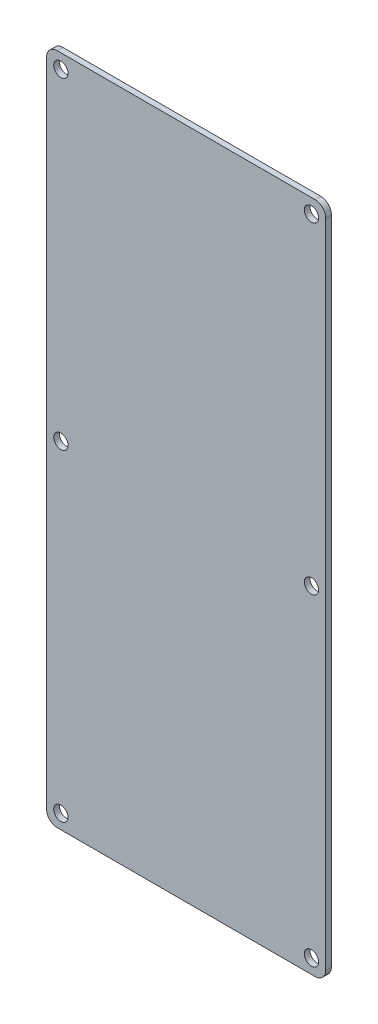
ISO-10303-21;
HEADER;
FILE_DESCRIPTION(('STEP AP214'),'2;1');
FILE_NAME('part.step','',(''),(''),'','','');
FILE_SCHEMA(('AUTOMOTIVE_DESIGN { 1 0 10303 214 1 1 1 1 }'));
ENDSEC;
DATA;
#1=APPLICATION_CONTEXT('core data for automotive mechanical design processes');
#2=APPLICATION_PROTOCOL_DEFINITION('international standard','automotive_design',2000,#1);
#3=PRODUCT_CONTEXT('',#1,'mechanical');
#4=PRODUCT('Part','Part','',(#3));
#5=PRODUCT_RELATED_PRODUCT_CATEGORY('part','',(#4));
#6=PRODUCT_DEFINITION_FORMATION('','',#4);
#7=PRODUCT_DEFINITION_CONTEXT('part definition',#1,'design');
#8=PRODUCT_DEFINITION('design','',#6,#7);
#9=PRODUCT_DEFINITION_SHAPE('','',#8);
#10=(LENGTH_UNIT() NAMED_UNIT(*) SI_UNIT(.MILLI.,.METRE.));
#11=(NAMED_UNIT(*) PLANE_ANGLE_UNIT() SI_UNIT($,.RADIAN.));
#12=(NAMED_UNIT(*) SI_UNIT($,.STERADIAN.) SOLID_ANGLE_UNIT());
#13=UNCERTAINTY_MEASURE_WITH_UNIT(LENGTH_MEASURE(1.E-05),#10,'distance_accuracy_value','');
#14=(GEOMETRIC_REPRESENTATION_CONTEXT(3) GLOBAL_UNCERTAINTY_ASSIGNED_CONTEXT((#13)) GLOBAL_UNIT_ASSIGNED_CONTEXT((#10,
#11,#12)) REPRESENTATION_CONTEXT('',''));
#15=CARTESIAN_POINT('',(0.,0.,0.));
#16=DIRECTION('',(0.,0.,1.));
#17=DIRECTION('',(1.,0.,0.));
#18=AXIS2_PLACEMENT_3D('',#15,#16,#17);
#19=CARTESIAN_POINT('',(-4.,184.,0.));
#20=DIRECTION('',(0.,1.,0.));
#21=DIRECTION('',(1.,0.,0.));
#22=AXIS2_PLACEMENT_3D('',#19,#20,#21);
#23=PLANE('',#22);
#24=DIRECTION('',(1.,0.,0.));
#25=VECTOR('',#24,1.);
#26=CARTESIAN_POINT('',(-4.00000000001,184.00000000001,0.));
#27=LINE('',#26,#25);
#28=CARTESIAN_POINT('',(-1.,184.,0.));
#29=VERTEX_POINT('',#28);
#30=CARTESIAN_POINT('',(71.,184.,0.));
#31=VERTEX_POINT('',#30);
#32=EDGE_CURVE('E40',#29,#31,#27,.T.);
#33=ORIENTED_EDGE('',*,*,#32,.F.);
#34=DIRECTION('',(0.,0.,1.));
#35=VECTOR('',#34,1.);
#36=CARTESIAN_POINT('',(-1.00000000001,184.00000000001,0.));
#37=LINE('',#36,#35);
#38=CARTESIAN_POINT('',(-1.,184.,1.59));
#39=VERTEX_POINT('',#38);
#40=EDGE_CURVE('E11',#29,#39,#37,.T.);
#41=ORIENTED_EDGE('',*,*,#40,.T.);
#42=DIRECTION('',(1.,0.,0.));
#43=VECTOR('',#42,1.);
#44=CARTESIAN_POINT('',(-4.00000000001,184.00000000001,1.59000000001));
#45=LINE('',#44,#43);
#46=CARTESIAN_POINT('',(71.,184.,1.59));
#47=VERTEX_POINT('',#46);
#48=EDGE_CURVE('E27',#39,#47,#45,.T.);
#49=ORIENTED_EDGE('',*,*,#48,.T.);
#50=DIRECTION('',(0.,0.,1.));
#51=VECTOR('',#50,1.);
#52=CARTESIAN_POINT('',(71.00000000001,184.00000000001,0.));
#53=LINE('',#52,#51);
#54=EDGE_CURVE('E115',#31,#47,#53,.T.);
#55=ORIENTED_EDGE('',*,*,#54,.F.);
#56=EDGE_LOOP('',(#33,#41,#49,#55));
#57=FACE_BOUND('',#56,.T.);
#58=ADVANCED_FACE('F17',(#57),#23,.T.);
#59=CARTESIAN_POINT('',(-4.,184.,0.));
#60=DIRECTION('',(0.,0.,1.));
#61=DIRECTION('',(1.,0.,0.));
#62=AXIS2_PLACEMENT_3D('',#59,#60,#61);
#63=PLANE('',#62);
#64=CARTESIAN_POINT('',(71.00000000001,181.00000000001,0.));
#65=DIRECTION('',(0.,0.,-1.));
#66=DIRECTION('',(0.,-1.,0.));
#67=AXIS2_PLACEMENT_3D('',#64,#65,#66);
#68=CIRCLE('',#67,3.00000000001);
#69=CARTESIAN_POINT('',(74.,181.,0.));
#70=VERTEX_POINT('',#69);
#71=EDGE_CURVE('E128',#31,#70,#68,.T.);
#72=ORIENTED_EDGE('',*,*,#71,.T.);
#73=DIRECTION('',(0.,-1.,0.));
#74=VECTOR('',#73,1.);
#75=CARTESIAN_POINT('',(74.00000000001,184.00000000001,0.));
#76=LINE('',#75,#74);
#77=CARTESIAN_POINT('',(74.,-1.,0.));
#78=VERTEX_POINT('',#77);
#79=EDGE_CURVE('E137',#70,#78,#76,.T.);
#80=ORIENTED_EDGE('',*,*,#79,.T.);
#81=CARTESIAN_POINT('',(71.00000000001,-1.00000000001,0.));
#82=DIRECTION('',(0.,0.,-1.));
#83=DIRECTION('',(0.,-1.,0.));
#84=AXIS2_PLACEMENT_3D('',#81,#82,#83);
#85=CIRCLE('',#84,3.00000000001);
#86=CARTESIAN_POINT('',(71.,-4.,0.));
#87=VERTEX_POINT('',#86);
#88=EDGE_CURVE('E76',#78,#87,#85,.T.);
#89=ORIENTED_EDGE('',*,*,#88,.T.);
#90=DIRECTION('',(-1.,0.,0.));
#91=VECTOR('',#90,1.);
#92=CARTESIAN_POINT('',(74.00000000001,-4.00000000001,0.));
#93=LINE('',#92,#91);
#94=CARTESIAN_POINT('',(-1.,-4.,0.));
#95=VERTEX_POINT('',#94);
#96=EDGE_CURVE('E89',#87,#95,#93,.T.);
#97=ORIENTED_EDGE('',*,*,#96,.T.);
#98=CARTESIAN_POINT('',(-1.00000000001,-1.00000000001,0.));
#99=DIRECTION('',(0.,0.,-1.));
#100=DIRECTION('',(0.,-1.,0.));
#101=AXIS2_PLACEMENT_3D('',#98,#99,#100);
#102=CIRCLE('',#101,3.00000000001);
#103=CARTESIAN_POINT('',(-4.,-1.,0.));
#104=VERTEX_POINT('',#103);
#105=EDGE_CURVE('E173',#95,#104,#102,.T.);
#106=ORIENTED_EDGE('',*,*,#105,.T.);
#107=DIRECTION('',(0.,1.,0.));
#108=VECTOR('',#107,1.);
#109=CARTESIAN_POINT('',(-4.00000000001,-4.00000000001,0.));
#110=LINE('',#109,#108);
#111=CARTESIAN_POINT('',(-4.,181.,0.));
#112=VERTEX_POINT('',#111);
#113=EDGE_CURVE('E132',#104,#112,#110,.T.);
#114=ORIENTED_EDGE('',*,*,#113,.T.);
#115=CARTESIAN_POINT('',(-1.00000000001,181.00000000001,0.));
#116=DIRECTION('',(0.,0.,1.));
#117=DIRECTION('',(0.,-1.,0.));
#118=AXIS2_PLACEMENT_3D('',#115,#116,#117);
#119=CIRCLE('',#118,3.00000000001);
#120=EDGE_CURVE('E131',#29,#112,#119,.T.);
#121=ORIENTED_EDGE('',*,*,#120,.F.);
#122=ORIENTED_EDGE('',*,*,#32,.T.);
#123=EDGE_LOOP('',(#72,#80,#89,#97,#106,#114,#121,#122));
#124=FACE_BOUND('',#123,.T.);
#125=CARTESIAN_POINT('',(70.00000000001,90.00000000001,0.));
#126=DIRECTION('',(0.,0.,1.));
#127=DIRECTION('',(1.,0.,0.));
#128=AXIS2_PLACEMENT_3D('',#125,#126,#127);
#129=CIRCLE('',#128,2.00000000001);
#130=CARTESIAN_POINT('',(72.00000000002,90.00000000001,0.));
#131=VERTEX_POINT('',#130);
#132=EDGE_CURVE('E133',#131,#131,#129,.T.);
#133=ORIENTED_EDGE('',*,*,#132,.T.);
#134=EDGE_LOOP('',(#133));
#135=FACE_BOUND('',#134,.T.);
#136=CARTESIAN_POINT('',(70.00000000001,0.,0.));
#137=DIRECTION('',(0.,0.,1.));
#138=DIRECTION('',(1.,0.,0.));
#139=AXIS2_PLACEMENT_3D('',#136,#137,#138);
#140=CIRCLE('',#139,2.00000000001);
#141=CARTESIAN_POINT('',(72.00000000002,0.,0.));
#142=VERTEX_POINT('',#141);
#143=EDGE_CURVE('E151',#142,#142,#140,.T.);
#144=ORIENTED_EDGE('',*,*,#143,.T.);
#145=EDGE_LOOP('',(#144));
#146=FACE_BOUND('',#145,.T.);
#147=CARTESIAN_POINT('',(0.,90.00000000001,0.));
#148=DIRECTION('',(0.,0.,1.));
#149=DIRECTION('',(1.,0.,0.));
#150=AXIS2_PLACEMENT_3D('',#147,#148,#149);
#151=CIRCLE('',#150,2.00000000001);
#152=CARTESIAN_POINT('',(2.00000000001,90.00000000001,0.));
#153=VERTEX_POINT('',#152);
#154=EDGE_CURVE('E156',#153,#153,#151,.T.);
#155=ORIENTED_EDGE('',*,*,#154,.T.);
#156=EDGE_LOOP('',(#155));
#157=FACE_BOUND('',#156,.T.);
#158=CARTESIAN_POINT('',(0.,0.,0.));
#159=DIRECTION('',(0.,0.,1.));
#160=DIRECTION('',(1.,0.,0.));
#161=AXIS2_PLACEMENT_3D('',#158,#159,#160);
#162=CIRCLE('',#161,2.00000000001);
#163=CARTESIAN_POINT('',(2.00000000001,0.,0.));
#164=VERTEX_POINT('',#163);
#165=EDGE_CURVE('E160',#164,#164,#162,.T.);
#166=ORIENTED_EDGE('',*,*,#165,.T.);
#167=EDGE_LOOP('',(#166));
#168=FACE_BOUND('',#167,.T.);
#169=CARTESIAN_POINT('',(70.00000000001,180.00000000001,0.));
#170=DIRECTION('',(0.,0.,1.));
#171=DIRECTION('',(1.,0.,0.));
#172=AXIS2_PLACEMENT_3D('',#169,#170,#171);
#173=CIRCLE('',#172,2.00000000001);
#174=CARTESIAN_POINT('',(72.00000000002,180.00000000001,0.));
#175=VERTEX_POINT('',#174);
#176=EDGE_CURVE('E146',#175,#175,#173,.T.);
#177=ORIENTED_EDGE('',*,*,#176,.T.);
#178=EDGE_LOOP('',(#177));
#179=FACE_BOUND('',#178,.T.);
#180=CARTESIAN_POINT('',(0.,180.00000000001,0.));
#181=DIRECTION('',(0.,0.,1.));
#182=DIRECTION('',(1.,0.,0.));
#183=AXIS2_PLACEMENT_3D('',#180,#181,#182);
#184=CIRCLE('',#183,2.00000000001);
#185=CARTESIAN_POINT('',(2.00000000001,180.00000000001,0.));
#186=VERTEX_POINT('',#185);
#187=EDGE_CURVE('E202',#186,#186,#184,.T.);
#188=ORIENTED_EDGE('',*,*,#187,.T.);
#189=EDGE_LOOP('',(#188));
#190=FACE_BOUND('',#189,.T.);
#191=ADVANCED_FACE('F126',(#124,#135,#146,#157,#168,#179,#190),#63,.F.);
#192=CARTESIAN_POINT('',(-1.,181.,0.));
#193=DIRECTION('',(0.,0.,1.));
#194=DIRECTION('',(0.,1.,0.));
#195=AXIS2_PLACEMENT_3D('',#192,#193,#194);
#196=CYLINDRICAL_SURFACE('',#195,3.);
#197=ORIENTED_EDGE('',*,*,#120,.T.);
#198=DIRECTION('',(0.,0.,1.));
#199=VECTOR('',#198,1.);
#200=CARTESIAN_POINT('',(-4.00000000001,181.00000000001,0.));
#201=LINE('',#200,#199);
#202=CARTESIAN_POINT('',(-4.,181.,1.59));
#203=VERTEX_POINT('',#202);
#204=EDGE_CURVE('E120',#112,#203,#201,.T.);
#205=ORIENTED_EDGE('',*,*,#204,.T.);
#206=CARTESIAN_POINT('',(-1.00000000001,181.00000000001,1.59000000001));
#207=DIRECTION('',(0.,0.,1.));
#208=DIRECTION('',(0.,-1.,0.));
#209=AXIS2_PLACEMENT_3D('',#206,#207,#208);
#210=CIRCLE('',#209,3.00000000001);
#211=EDGE_CURVE('E177',#39,#203,#210,.T.);
#212=ORIENTED_EDGE('',*,*,#211,.F.);
#213=ORIENTED_EDGE('',*,*,#40,.F.);
#214=EDGE_LOOP('',(#197,#205,#212,#213));
#215=FACE_BOUND('',#214,.T.);
#216=ADVANCED_FACE('F270',(#215),#196,.T.);
#217=CARTESIAN_POINT('',(71.,181.,0.));
#218=DIRECTION('',(0.,0.,1.));
#219=DIRECTION('',(0.,1.,0.));
#220=AXIS2_PLACEMENT_3D('',#217,#218,#219);
#221=CYLINDRICAL_SURFACE('',#220,3.);
#222=ORIENTED_EDGE('',*,*,#54,.T.);
#223=CARTESIAN_POINT('',(71.00000000001,181.00000000001,1.59000000001));
#224=DIRECTION('',(0.,0.,-1.));
#225=DIRECTION('',(0.,-1.,0.));
#226=AXIS2_PLACEMENT_3D('',#223,#224,#225);
#227=CIRCLE('',#226,3.00000000001);
#228=CARTESIAN_POINT('',(74.,181.,1.59));
#229=VERTEX_POINT('',#228);
#230=EDGE_CURVE('E121',#47,#229,#227,.T.);
#231=ORIENTED_EDGE('',*,*,#230,.T.);
#232=DIRECTION('',(0.,0.,1.));
#233=VECTOR('',#232,1.);
#234=CARTESIAN_POINT('',(74.00000000001,181.00000000001,0.));
#235=LINE('',#234,#233);
#236=EDGE_CURVE('E135',#70,#229,#235,.T.);
#237=ORIENTED_EDGE('',*,*,#236,.F.);
#238=ORIENTED_EDGE('',*,*,#71,.F.);
#239=EDGE_LOOP('',(#222,#231,#237,#238));
#240=FACE_BOUND('',#239,.T.);
#241=ADVANCED_FACE('F134',(#240),#221,.T.);
#242=CARTESIAN_POINT('',(-4.,184.,1.59));
#243=DIRECTION('',(0.,0.,1.));
#244=DIRECTION('',(1.,0.,0.));
#245=AXIS2_PLACEMENT_3D('',#242,#243,#244);
#246=PLANE('',#245);
#247=ORIENTED_EDGE('',*,*,#48,.F.);
#248=ORIENTED_EDGE('',*,*,#211,.T.);
#249=DIRECTION('',(0.,1.,0.));
#250=VECTOR('',#249,1.);
#251=CARTESIAN_POINT('',(-4.00000000001,-4.00000000001,1.59000000001));
#252=LINE('',#251,#250);
#253=CARTESIAN_POINT('',(-4.,-1.,1.59));
#254=VERTEX_POINT('',#253);
#255=EDGE_CURVE('E161',#254,#203,#252,.T.);
#256=ORIENTED_EDGE('',*,*,#255,.F.);
#257=CARTESIAN_POINT('',(-1.00000000001,-1.00000000001,1.59000000001));
#258=DIRECTION('',(0.,0.,-1.));
#259=DIRECTION('',(0.,-1.,0.));
#260=AXIS2_PLACEMENT_3D('',#257,#258,#259);
#261=CIRCLE('',#260,3.00000000001);
#262=CARTESIAN_POINT('',(-1.,-4.,1.59));
#263=VERTEX_POINT('',#262);
#264=EDGE_CURVE('E198',#263,#254,#261,.T.);
#265=ORIENTED_EDGE('',*,*,#264,.F.);
#266=DIRECTION('',(-1.,0.,0.));
#267=VECTOR('',#266,1.);
#268=CARTESIAN_POINT('',(74.00000000001,-4.00000000001,1.59000000001));
#269=LINE('',#268,#267);
#270=CARTESIAN_POINT('',(71.,-4.,1.59));
#271=VERTEX_POINT('',#270);
#272=EDGE_CURVE('E166',#271,#263,#269,.T.);
#273=ORIENTED_EDGE('',*,*,#272,.F.);
#274=CARTESIAN_POINT('',(71.00000000001,-1.00000000001,1.59000000001));
#275=DIRECTION('',(0.,0.,-1.));
#276=DIRECTION('',(0.,-1.,0.));
#277=AXIS2_PLACEMENT_3D('',#274,#275,#276);
#278=CIRCLE('',#277,3.00000000001);
#279=CARTESIAN_POINT('',(74.,-1.,1.59));
#280=VERTEX_POINT('',#279);
#281=EDGE_CURVE('E216',#280,#271,#278,.T.);
#282=ORIENTED_EDGE('',*,*,#281,.F.);
#283=DIRECTION('',(0.,-1.,0.));
#284=VECTOR('',#283,1.);
#285=CARTESIAN_POINT('',(74.00000000001,184.00000000001,1.59000000001));
#286=LINE('',#285,#284);
#287=EDGE_CURVE('E182',#229,#280,#286,.T.);
#288=ORIENTED_EDGE('',*,*,#287,.F.);
#289=ORIENTED_EDGE('',*,*,#230,.F.);
#290=EDGE_LOOP('',(#247,#248,#256,#265,#273,#282,#288,#289));
#291=FACE_BOUND('',#290,.T.);
#292=CARTESIAN_POINT('',(70.00000000001,90.00000000001,1.59000000001));
#293=DIRECTION('',(0.,0.,1.));
#294=DIRECTION('',(1.,0.,0.));
#295=AXIS2_PLACEMENT_3D('',#292,#293,#294);
#296=CIRCLE('',#295,2.00000000001);
#297=CARTESIAN_POINT('',(72.00000000002,90.00000000001,1.59000000001));
#298=VERTEX_POINT('',#297);
#299=EDGE_CURVE('E171',#298,#298,#296,.T.);
#300=ORIENTED_EDGE('',*,*,#299,.F.);
#301=EDGE_LOOP('',(#300));
#302=FACE_BOUND('',#301,.T.);
#303=CARTESIAN_POINT('',(70.00000000001,0.,1.59000000001));
#304=DIRECTION('',(0.,0.,1.));
#305=DIRECTION('',(1.,0.,0.));
#306=AXIS2_PLACEMENT_3D('',#303,#304,#305);
#307=CIRCLE('',#306,2.00000000001);
#308=CARTESIAN_POINT('',(72.00000000002,0.,1.59000000001));
#309=VERTEX_POINT('',#308);
#310=EDGE_CURVE('E228',#309,#309,#307,.T.);
#311=ORIENTED_EDGE('',*,*,#310,.F.);
#312=EDGE_LOOP('',(#311));
#313=FACE_BOUND('',#312,.T.);
#314=CARTESIAN_POINT('',(0.,90.00000000001,1.59000000001));
#315=DIRECTION('',(0.,0.,1.));
#316=DIRECTION('',(1.,0.,0.));
#317=AXIS2_PLACEMENT_3D('',#314,#315,#316);
#318=CIRCLE('',#317,2.00000000001);
#319=CARTESIAN_POINT('',(2.00000000001,90.00000000001,1.59000000001));
#320=VERTEX_POINT('',#319);
#321=EDGE_CURVE('E223',#320,#320,#318,.T.);
#322=ORIENTED_EDGE('',*,*,#321,.F.);
#323=EDGE_LOOP('',(#322));
#324=FACE_BOUND('',#323,.T.);
#325=CARTESIAN_POINT('',(0.,0.,1.59000000001));
#326=DIRECTION('',(0.,0.,1.));
#327=DIRECTION('',(1.,0.,0.));
#328=AXIS2_PLACEMENT_3D('',#325,#326,#327);
#329=CIRCLE('',#328,2.00000000001);
#330=CARTESIAN_POINT('',(2.00000000001,0.,1.59000000001));
#331=VERTEX_POINT('',#330);
#332=EDGE_CURVE('E219',#331,#331,#329,.T.);
#333=ORIENTED_EDGE('',*,*,#332,.F.);
#334=EDGE_LOOP('',(#333));
#335=FACE_BOUND('',#334,.T.);
#336=CARTESIAN_POINT('',(70.00000000001,180.00000000001,1.59000000001));
#337=DIRECTION('',(0.,0.,1.));
#338=DIRECTION('',(1.,0.,0.));
#339=AXIS2_PLACEMENT_3D('',#336,#337,#338);
#340=CIRCLE('',#339,2.00000000001);
#341=CARTESIAN_POINT('',(72.00000000002,180.00000000001,1.59000000001));
#342=VERTEX_POINT('',#341);
#343=EDGE_CURVE('E212',#342,#342,#340,.T.);
#344=ORIENTED_EDGE('',*,*,#343,.F.);
#345=EDGE_LOOP('',(#344));
#346=FACE_BOUND('',#345,.T.);
#347=CARTESIAN_POINT('',(0.,180.00000000001,1.59000000001));
#348=DIRECTION('',(0.,0.,1.));
#349=DIRECTION('',(1.,0.,0.));
#350=AXIS2_PLACEMENT_3D('',#347,#348,#349);
#351=CIRCLE('',#350,2.00000000001);
#352=CARTESIAN_POINT('',(2.00000000001,180.00000000001,1.59000000001));
#353=VERTEX_POINT('',#352);
#354=EDGE_CURVE('E208',#353,#353,#351,.T.);
#355=ORIENTED_EDGE('',*,*,#354,.F.);
#356=EDGE_LOOP('',(#355));
#357=FACE_BOUND('',#356,.T.);
#358=ADVANCED_FACE('F278',(#291,#302,#313,#324,#335,#346,#357),#246,.T.);
#359=CARTESIAN_POINT('',(-4.,-4.,0.));
#360=DIRECTION('',(-1.,0.,0.));
#361=DIRECTION('',(0.,0.,1.));
#362=AXIS2_PLACEMENT_3D('',#359,#360,#361);
#363=PLANE('',#362);
#364=ORIENTED_EDGE('',*,*,#113,.F.);
#365=DIRECTION('',(0.,0.,1.));
#366=VECTOR('',#365,1.);
#367=CARTESIAN_POINT('',(-4.00000000001,-1.00000000001,0.));
#368=LINE('',#367,#366);
#369=EDGE_CURVE('E165',#104,#254,#368,.T.);
#370=ORIENTED_EDGE('',*,*,#369,.T.);
#371=ORIENTED_EDGE('',*,*,#255,.T.);
#372=ORIENTED_EDGE('',*,*,#204,.F.);
#373=EDGE_LOOP('',(#364,#370,#371,#372));
#374=FACE_BOUND('',#373,.T.);
#375=ADVANCED_FACE('F268',(#374),#363,.T.);
#376=CARTESIAN_POINT('',(74.,184.,0.));
#377=DIRECTION('',(1.,0.,0.));
#378=DIRECTION('',(0.,1.,0.));
#379=AXIS2_PLACEMENT_3D('',#376,#377,#378);
#380=PLANE('',#379);
#381=ORIENTED_EDGE('',*,*,#79,.F.);
#382=ORIENTED_EDGE('',*,*,#236,.T.);
#383=ORIENTED_EDGE('',*,*,#287,.T.);
#384=DIRECTION('',(0.,0.,1.));
#385=VECTOR('',#384,1.);
#386=CARTESIAN_POINT('',(74.00000000001,-1.00000000001,0.));
#387=LINE('',#386,#385);
#388=EDGE_CURVE('E213',#78,#280,#387,.T.);
#389=ORIENTED_EDGE('',*,*,#388,.F.);
#390=EDGE_LOOP('',(#381,#382,#383,#389));
#391=FACE_BOUND('',#390,.T.);
#392=ADVANCED_FACE('F332',(#391),#380,.T.);
#393=CARTESIAN_POINT('',(-1.,-1.,0.));
#394=DIRECTION('',(0.,0.,1.));
#395=DIRECTION('',(0.,-1.,0.));
#396=AXIS2_PLACEMENT_3D('',#393,#394,#395);
#397=CYLINDRICAL_SURFACE('',#396,3.);
#398=DIRECTION('',(0.,0.,1.));
#399=VECTOR('',#398,1.);
#400=CARTESIAN_POINT('',(-1.00000000001,-4.00000000001,0.));
#401=LINE('',#400,#399);
#402=EDGE_CURVE('E189',#95,#263,#401,.T.);
#403=ORIENTED_EDGE('',*,*,#402,.T.);
#404=ORIENTED_EDGE('',*,*,#264,.T.);
#405=ORIENTED_EDGE('',*,*,#369,.F.);
#406=ORIENTED_EDGE('',*,*,#105,.F.);
#407=EDGE_LOOP('',(#403,#404,#405,#406));
#408=FACE_BOUND('',#407,.T.);
#409=ADVANCED_FACE('F265',(#408),#397,.T.);
#410=CARTESIAN_POINT('',(71.,-1.,0.));
#411=DIRECTION('',(0.,0.,1.));
#412=DIRECTION('',(1.,0.,0.));
#413=AXIS2_PLACEMENT_3D('',#410,#411,#412);
#414=CYLINDRICAL_SURFACE('',#413,3.);
#415=ORIENTED_EDGE('',*,*,#388,.T.);
#416=ORIENTED_EDGE('',*,*,#281,.T.);
#417=DIRECTION('',(0.,0.,1.));
#418=VECTOR('',#417,1.);
#419=CARTESIAN_POINT('',(71.00000000001,-4.00000000001,0.));
#420=LINE('',#419,#418);
#421=EDGE_CURVE('E170',#87,#271,#420,.T.);
#422=ORIENTED_EDGE('',*,*,#421,.F.);
#423=ORIENTED_EDGE('',*,*,#88,.F.);
#424=EDGE_LOOP('',(#415,#416,#422,#423));
#425=FACE_BOUND('',#424,.T.);
#426=ADVANCED_FACE('F326',(#425),#414,.T.);
#427=CARTESIAN_POINT('',(74.,-4.,0.));
#428=DIRECTION('',(0.,-1.,0.));
#429=DIRECTION('',(0.,0.,-1.));
#430=AXIS2_PLACEMENT_3D('',#427,#428,#429);
#431=PLANE('',#430);
#432=ORIENTED_EDGE('',*,*,#96,.F.);
#433=ORIENTED_EDGE('',*,*,#421,.T.);
#434=ORIENTED_EDGE('',*,*,#272,.T.);
#435=ORIENTED_EDGE('',*,*,#402,.F.);
#436=EDGE_LOOP('',(#432,#433,#434,#435));
#437=FACE_BOUND('',#436,.T.);
#438=ADVANCED_FACE('F288',(#437),#431,.T.);
#439=CARTESIAN_POINT('',(70.,90.,0.));
#440=DIRECTION('',(0.,0.,-1.));
#441=DIRECTION('',(1.,0.,0.));
#442=AXIS2_PLACEMENT_3D('',#439,#440,#441);
#443=CYLINDRICAL_SURFACE('',#442,2.);
#444=ORIENTED_EDGE('',*,*,#299,.T.);
#445=EDGE_LOOP('',(#444));
#446=FACE_BOUND('',#445,.T.);
#447=ORIENTED_EDGE('',*,*,#132,.F.);
#448=EDGE_LOOP('',(#447));
#449=FACE_BOUND('',#448,.T.);
#450=ADVANCED_FACE('F301',(#446,#449),#443,.F.);
#451=CARTESIAN_POINT('',(70.,0.,0.));
#452=DIRECTION('',(0.,0.,-1.));
#453=DIRECTION('',(1.,0.,0.));
#454=AXIS2_PLACEMENT_3D('',#451,#452,#453);
#455=CYLINDRICAL_SURFACE('',#454,2.);
#456=ORIENTED_EDGE('',*,*,#310,.T.);
#457=EDGE_LOOP('',(#456));
#458=FACE_BOUND('',#457,.T.);
#459=ORIENTED_EDGE('',*,*,#143,.F.);
#460=EDGE_LOOP('',(#459));
#461=FACE_BOUND('',#460,.T.);
#462=ADVANCED_FACE('F293',(#458,#461),#455,.F.);
#463=CARTESIAN_POINT('',(0.,90.,0.));
#464=DIRECTION('',(0.,0.,-1.));
#465=DIRECTION('',(1.,0.,0.));
#466=AXIS2_PLACEMENT_3D('',#463,#464,#465);
#467=CYLINDRICAL_SURFACE('',#466,2.);
#468=ORIENTED_EDGE('',*,*,#321,.T.);
#469=EDGE_LOOP('',(#468));
#470=FACE_BOUND('',#469,.T.);
#471=ORIENTED_EDGE('',*,*,#154,.F.);
#472=EDGE_LOOP('',(#471));
#473=FACE_BOUND('',#472,.T.);
#474=ADVANCED_FACE('F290',(#470,#473),#467,.F.);
#475=CARTESIAN_POINT('',(0.,0.,0.));
#476=DIRECTION('',(0.,0.,-1.));
#477=DIRECTION('',(1.,0.,0.));
#478=AXIS2_PLACEMENT_3D('',#475,#476,#477);
#479=CYLINDRICAL_SURFACE('',#478,2.);
#480=ORIENTED_EDGE('',*,*,#332,.T.);
#481=EDGE_LOOP('',(#480));
#482=FACE_BOUND('',#481,.T.);
#483=ORIENTED_EDGE('',*,*,#165,.F.);
#484=EDGE_LOOP('',(#483));
#485=FACE_BOUND('',#484,.T.);
#486=ADVANCED_FACE('F292',(#482,#485),#479,.F.);
#487=CARTESIAN_POINT('',(70.,180.,0.));
#488=DIRECTION('',(0.,0.,-1.));
#489=DIRECTION('',(1.,0.,0.));
#490=AXIS2_PLACEMENT_3D('',#487,#488,#489);
#491=CYLINDRICAL_SURFACE('',#490,2.);
#492=ORIENTED_EDGE('',*,*,#343,.T.);
#493=EDGE_LOOP('',(#492));
#494=FACE_BOUND('',#493,.T.);
#495=ORIENTED_EDGE('',*,*,#176,.F.);
#496=EDGE_LOOP('',(#495));
#497=FACE_BOUND('',#496,.T.);
#498=ADVANCED_FACE('F19',(#494,#497),#491,.F.);
#499=CARTESIAN_POINT('',(0.,180.,0.));
#500=DIRECTION('',(0.,0.,-1.));
#501=DIRECTION('',(1.,0.,0.));
#502=AXIS2_PLACEMENT_3D('',#499,#500,#501);
#503=CYLINDRICAL_SURFACE('',#502,2.);
#504=ORIENTED_EDGE('',*,*,#354,.T.);
#505=EDGE_LOOP('',(#504));
#506=FACE_BOUND('',#505,.T.);
#507=ORIENTED_EDGE('',*,*,#187,.F.);
#508=EDGE_LOOP('',(#507));
#509=FACE_BOUND('',#508,.T.);
#510=ADVANCED_FACE('F316',(#506,#509),#503,.F.);
#511=CLOSED_SHELL('',(#58,#191,#216,#241,#358,#375,#392,#409,#426,#438,#450,#462,#474,#486,#498,#510));
#512=MANIFOLD_SOLID_BREP('B1',#511);
#513=ADVANCED_BREP_SHAPE_REPRESENTATION('',(#18,#512),#14);
#514=SHAPE_DEFINITION_REPRESENTATION(#9,#513);
ENDSEC;
END-ISO-10303-21;
